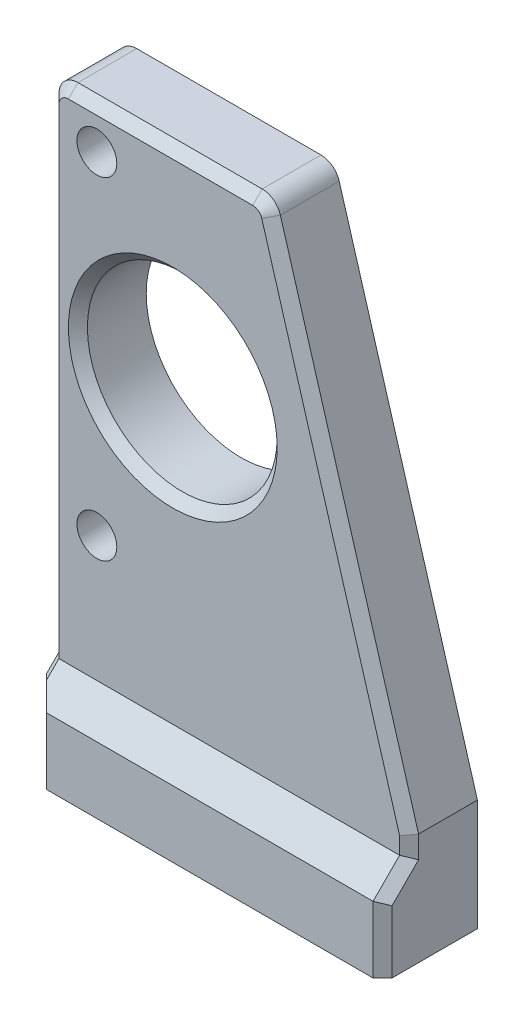
ISO-10303-21;
HEADER;
FILE_DESCRIPTION(('STEP AP214'),'2;1');
FILE_NAME('part.step','',(''),(''),'','','');
FILE_SCHEMA(('AUTOMOTIVE_DESIGN { 1 0 10303 214 1 1 1 1 }'));
ENDSEC;
DATA;
#1=APPLICATION_CONTEXT('core data for automotive mechanical design processes');
#2=APPLICATION_PROTOCOL_DEFINITION('international standard','automotive_design',2000,#1);
#3=PRODUCT_CONTEXT('',#1,'mechanical');
#4=PRODUCT('Part','Part','',(#3));
#5=PRODUCT_RELATED_PRODUCT_CATEGORY('part','',(#4));
#6=PRODUCT_DEFINITION_FORMATION('','',#4);
#7=PRODUCT_DEFINITION_CONTEXT('part definition',#1,'design');
#8=PRODUCT_DEFINITION('design','',#6,#7);
#9=PRODUCT_DEFINITION_SHAPE('','',#8);
#10=(LENGTH_UNIT() NAMED_UNIT(*) SI_UNIT(.MILLI.,.METRE.));
#11=(NAMED_UNIT(*) PLANE_ANGLE_UNIT() SI_UNIT($,.RADIAN.));
#12=(NAMED_UNIT(*) SI_UNIT($,.STERADIAN.) SOLID_ANGLE_UNIT());
#13=UNCERTAINTY_MEASURE_WITH_UNIT(LENGTH_MEASURE(1.E-05),#10,'distance_accuracy_value','');
#14=(GEOMETRIC_REPRESENTATION_CONTEXT(3) GLOBAL_UNCERTAINTY_ASSIGNED_CONTEXT((#13)) GLOBAL_UNIT_ASSIGNED_CONTEXT((#10,
#11,#12)) REPRESENTATION_CONTEXT('',''));
#15=CARTESIAN_POINT('',(0.,0.,0.));
#16=DIRECTION('',(0.,0.,1.));
#17=DIRECTION('',(1.,0.,0.));
#18=AXIS2_PLACEMENT_3D('',#15,#16,#17);
#19=CARTESIAN_POINT('',(-8.08878115586111,23.0319457170168,10.));
#20=DIRECTION('',(0.,0.,-1.));
#21=DIRECTION('',(-1.,0.,0.));
#22=AXIS2_PLACEMENT_3D('',#19,#20,#21);
#23=CYLINDRICAL_SURFACE('',#22,2.1);
#24=CARTESIAN_POINT('',(-8.08878115586111,23.0319457170168,7.2));
#25=DIRECTION('',(0.,0.,1.));
#26=DIRECTION('',(1.,0.,0.));
#27=AXIS2_PLACEMENT_3D('',#24,#25,#26);
#28=CIRCLE('',#27,2.1);
#29=CARTESIAN_POINT('',(-5.98878115586111,23.0319457170168,7.2));
#30=VERTEX_POINT('',#29);
#31=EDGE_CURVE('E183',#30,#30,#28,.T.);
#32=ORIENTED_EDGE('',*,*,#31,.T.);
#33=EDGE_LOOP('',(#32));
#34=FACE_BOUND('',#33,.T.);
#35=CARTESIAN_POINT('',(-8.08878115586111,23.0319457170168,3.));
#36=DIRECTION('',(0.,0.,-1.));
#37=DIRECTION('',(-1.,0.,0.));
#38=AXIS2_PLACEMENT_3D('',#35,#36,#37);
#39=CIRCLE('',#38,2.1);
#40=CARTESIAN_POINT('',(-10.1887811558611,23.0319457170168,3.));
#41=VERTEX_POINT('',#40);
#42=EDGE_CURVE('E41',#41,#41,#39,.T.);
#43=ORIENTED_EDGE('',*,*,#42,.T.);
#44=EDGE_LOOP('',(#43));
#45=FACE_BOUND('',#44,.T.);
#46=ADVANCED_FACE('F37',(#34,#45),#23,.F.);
#47=CARTESIAN_POINT('',(-13.0887811558611,62.3706180274269,10.));
#48=DIRECTION('',(0.,-1.,0.));
#49=DIRECTION('',(0.,0.,-1.));
#50=AXIS2_PLACEMENT_3D('',#47,#48,#49);
#51=PLANE('',#50);
#52=DIRECTION('',(0.,0.,-1.));
#53=VECTOR('',#52,1.);
#54=CARTESIAN_POINT('',(-11.0887811558611,62.3706180274269,10.));
#55=LINE('',#54,#53);
#56=CARTESIAN_POINT('',(-11.0887811558611,62.3706180274269,0.));
#57=VERTEX_POINT('',#56);
#58=CARTESIAN_POINT('',(-11.0887811558611,62.3706180274269,6.2));
#59=VERTEX_POINT('',#58);
#60=EDGE_CURVE('E201',#57,#59,#55,.F.);
#61=ORIENTED_EDGE('',*,*,#60,.T.);
#62=DIRECTION('',(1.,0.,0.));
#63=VECTOR('',#62,1.);
#64=CARTESIAN_POINT('',(8.33058138017552,62.3706180274269,6.2));
#65=LINE('',#64,#63);
#66=CARTESIAN_POINT('',(8.33058138017552,62.3706180274269,6.2));
#67=VERTEX_POINT('',#66);
#68=EDGE_CURVE('E249',#59,#67,#65,.T.);
#69=ORIENTED_EDGE('',*,*,#68,.T.);
#70=DIRECTION('',(0.,0.,-1.));
#71=VECTOR('',#70,1.);
#72=CARTESIAN_POINT('',(8.33058138017552,62.3706180274269,10.));
#73=LINE('',#72,#71);
#74=CARTESIAN_POINT('',(8.33058138017552,62.3706180274269,0.));
#75=VERTEX_POINT('',#74);
#76=EDGE_CURVE('E199',#67,#75,#73,.T.);
#77=ORIENTED_EDGE('',*,*,#76,.T.);
#78=DIRECTION('',(-1.,0.,0.));
#79=VECTOR('',#78,1.);
#80=CARTESIAN_POINT('',(-13.0887811558611,62.3706180274269,0.));
#81=LINE('',#80,#79);
#82=EDGE_CURVE('E177',#75,#57,#81,.T.);
#83=ORIENTED_EDGE('',*,*,#82,.T.);
#84=EDGE_LOOP('',(#61,#69,#77,#83));
#85=FACE_BOUND('',#84,.T.);
#86=ADVANCED_FACE('F340',(#85),#51,.F.);
#87=CARTESIAN_POINT('',(-8.08878115586112,58.0319457170168,10.));
#88=DIRECTION('',(0.,0.,-1.));
#89=DIRECTION('',(-1.,0.,0.));
#90=AXIS2_PLACEMENT_3D('',#87,#88,#89);
#91=CYLINDRICAL_SURFACE('',#90,2.1);
#92=CARTESIAN_POINT('',(-8.08878115586112,58.0319457170168,0.));
#93=DIRECTION('',(0.,0.,1.));
#94=DIRECTION('',(-1.,0.,0.));
#95=AXIS2_PLACEMENT_3D('',#92,#93,#94);
#96=CIRCLE('',#95,2.1);
#97=CARTESIAN_POINT('',(-10.1887811558611,58.0319457170168,0.));
#98=VERTEX_POINT('',#97);
#99=EDGE_CURVE('E343',#98,#98,#96,.T.);
#100=ORIENTED_EDGE('',*,*,#99,.F.);
#101=EDGE_LOOP('',(#100));
#102=FACE_BOUND('',#101,.T.);
#103=CARTESIAN_POINT('',(-8.08878115586112,58.0319457170168,7.2));
#104=DIRECTION('',(0.,0.,1.));
#105=DIRECTION('',(1.,0.,0.));
#106=AXIS2_PLACEMENT_3D('',#103,#104,#105);
#107=CIRCLE('',#106,2.1);
#108=CARTESIAN_POINT('',(-5.98878115586112,58.0319457170168,7.2));
#109=VERTEX_POINT('',#108);
#110=EDGE_CURVE('E186',#109,#109,#107,.T.);
#111=ORIENTED_EDGE('',*,*,#110,.T.);
#112=EDGE_LOOP('',(#111));
#113=FACE_BOUND('',#112,.T.);
#114=ADVANCED_FACE('F399',(#102,#113),#91,.F.);
#115=CARTESIAN_POINT('',(0.,0.,10.));
#116=DIRECTION('',(0.,0.,-1.));
#117=DIRECTION('',(-1.,0.,0.));
#118=AXIS2_PLACEMENT_3D('',#115,#116,#117);
#119=PLANE('',#118);
#120=DIRECTION('',(-1.,0.,0.));
#121=VECTOR('',#120,1.);
#122=CARTESIAN_POINT('',(0.,6.99999999999997,10.));
#123=LINE('',#122,#121);
#124=CARTESIAN_POINT('',(23.8127338897394,6.99999999999997,10.));
#125=VERTEX_POINT('',#124);
#126=CARTESIAN_POINT('',(-10.5887811558611,6.99999999999997,10.));
#127=VERTEX_POINT('',#126);
#128=EDGE_CURVE('E182',#125,#127,#123,.T.);
#129=ORIENTED_EDGE('',*,*,#128,.T.);
#130=DIRECTION('',(0.,-1.,0.));
#131=VECTOR('',#130,1.);
#132=CARTESIAN_POINT('',(-10.5887811558611,0.,10.));
#133=LINE('',#132,#131);
#134=CARTESIAN_POINT('',(-10.5887811558611,0.,10.));
#135=VERTEX_POINT('',#134);
#136=EDGE_CURVE('E251',#127,#135,#133,.T.);
#137=ORIENTED_EDGE('',*,*,#136,.T.);
#138=DIRECTION('',(1.,0.,0.));
#139=VECTOR('',#138,1.);
#140=CARTESIAN_POINT('',(28.2870012815656,0.,10.));
#141=LINE('',#140,#139);
#142=CARTESIAN_POINT('',(23.8127338897394,0.,10.));
#143=VERTEX_POINT('',#142);
#144=EDGE_CURVE('E173',#135,#143,#141,.T.);
#145=ORIENTED_EDGE('',*,*,#144,.T.);
#146=DIRECTION('',(0.,1.,0.));
#147=VECTOR('',#146,1.);
#148=CARTESIAN_POINT('',(23.8127338897394,0.,10.));
#149=LINE('',#148,#147);
#150=EDGE_CURVE('E225',#143,#125,#149,.T.);
#151=ORIENTED_EDGE('',*,*,#150,.T.);
#152=EDGE_LOOP('',(#129,#137,#145,#151));
#153=FACE_BOUND('',#152,.T.);
#154=ADVANCED_FACE('F288',(#153),#119,.F.);
#155=CARTESIAN_POINT('',(0.,0.,0.));
#156=DIRECTION('',(0.,0.,-1.));
#157=DIRECTION('',(-1.,0.,0.));
#158=AXIS2_PLACEMENT_3D('',#155,#156,#157);
#159=PLANE('',#158);
#160=CARTESIAN_POINT('',(-8.08878115586111,23.0319457170168,0.));
#161=DIRECTION('',(0.,0.,-1.));
#162=DIRECTION('',(-1.,0.,0.));
#163=AXIS2_PLACEMENT_3D('',#160,#161,#162);
#164=CIRCLE('',#163,3.6);
#165=CARTESIAN_POINT('',(-11.6887811558611,23.0319457170168,0.));
#166=VERTEX_POINT('',#165);
#167=EDGE_CURVE('E371',#166,#166,#164,.T.);
#168=ORIENTED_EDGE('',*,*,#167,.F.);
#169=EDGE_LOOP('',(#168));
#170=FACE_BOUND('',#169,.T.);
#171=DIRECTION('',(0.,-1.,0.));
#172=VECTOR('',#171,1.);
#173=CARTESIAN_POINT('',(-13.0887811558611,0.,0.));
#174=LINE('',#173,#172);
#175=CARTESIAN_POINT('',(-13.0887811558611,60.3706180274269,0.));
#176=VERTEX_POINT('',#175);
#177=CARTESIAN_POINT('',(-13.0887811558611,0.,0.));
#178=VERTEX_POINT('',#177);
#179=EDGE_CURVE('E174',#176,#178,#174,.T.);
#180=ORIENTED_EDGE('',*,*,#179,.F.);
#181=CARTESIAN_POINT('',(-11.0887811558611,60.3706180274269,0.));
#182=DIRECTION('',(0.,0.,-1.));
#183=DIRECTION('',(-1.,0.,0.));
#184=AXIS2_PLACEMENT_3D('',#181,#182,#183);
#185=CIRCLE('',#184,2.);
#186=EDGE_CURVE('E197',#176,#57,#185,.T.);
#187=ORIENTED_EDGE('',*,*,#186,.T.);
#188=ORIENTED_EDGE('',*,*,#82,.F.);
#189=CARTESIAN_POINT('',(8.33058138017552,60.3706180274269,0.));
#190=DIRECTION('',(0.,0.,-1.));
#191=DIRECTION('',(-1.,0.,0.));
#192=AXIS2_PLACEMENT_3D('',#189,#190,#191);
#193=CIRCLE('',#192,2.);
#194=CARTESIAN_POINT('',(10.2483242545276,60.9382995119514,0.));
#195=VERTEX_POINT('',#194);
#196=EDGE_CURVE('E195',#75,#195,#193,.T.);
#197=ORIENTED_EDGE('',*,*,#196,.T.);
#198=DIRECTION('',(-0.283840742262227,0.958871437176032,0.));
#199=VECTOR('',#198,1.);
#200=CARTESIAN_POINT('',(24.8127338897394,11.7367779571846,0.));
#201=LINE('',#200,#199);
#202=CARTESIAN_POINT('',(24.8127338897394,11.7367779571846,0.));
#203=VERTEX_POINT('',#202);
#204=EDGE_CURVE('E158',#203,#195,#201,.T.);
#205=ORIENTED_EDGE('',*,*,#204,.F.);
#206=DIRECTION('',(0.,1.,0.));
#207=VECTOR('',#206,1.);
#208=CARTESIAN_POINT('',(24.8127338897394,11.7367779571846,0.));
#209=LINE('',#208,#207);
#210=CARTESIAN_POINT('',(24.8127338897394,0.,0.));
#211=VERTEX_POINT('',#210);
#212=EDGE_CURVE('E149',#211,#203,#209,.T.);
#213=ORIENTED_EDGE('',*,*,#212,.F.);
#214=DIRECTION('',(1.,0.,0.));
#215=VECTOR('',#214,1.);
#216=CARTESIAN_POINT('',(28.2870012815656,0.,0.));
#217=LINE('',#216,#215);
#218=EDGE_CURVE('E165',#178,#211,#217,.T.);
#219=ORIENTED_EDGE('',*,*,#218,.F.);
#220=EDGE_LOOP('',(#180,#187,#188,#197,#205,#213,#219));
#221=FACE_BOUND('',#220,.T.);
#222=CARTESIAN_POINT('',(-0.0887811558611135,40.5319457170168,0.));
#223=DIRECTION('',(0.,0.,1.));
#224=DIRECTION('',(1.,0.,0.));
#225=AXIS2_PLACEMENT_3D('',#222,#223,#224);
#226=CIRCLE('',#225,10.);
#227=CARTESIAN_POINT('',(9.91121884413889,40.5319457170168,0.));
#228=VERTEX_POINT('',#227);
#229=EDGE_CURVE('E187',#228,#228,#226,.T.);
#230=ORIENTED_EDGE('',*,*,#229,.T.);
#231=EDGE_LOOP('',(#230));
#232=FACE_BOUND('',#231,.T.);
#233=ORIENTED_EDGE('',*,*,#99,.T.);
#234=EDGE_LOOP('',(#233));
#235=FACE_BOUND('',#234,.T.);
#236=ADVANCED_FACE('F163',(#170,#221,#232,#235),#159,.T.);
#237=CARTESIAN_POINT('',(-13.0887811558611,0.,10.));
#238=DIRECTION('',(1.,0.,0.));
#239=DIRECTION('',(0.,0.,-1.));
#240=AXIS2_PLACEMENT_3D('',#237,#238,#239);
#241=PLANE('',#240);
#242=DIRECTION('',(0.,0.,-1.));
#243=VECTOR('',#242,1.);
#244=CARTESIAN_POINT('',(-13.0887811558611,0.,10.));
#245=LINE('',#244,#243);
#246=CARTESIAN_POINT('',(-13.0887811558611,0.,7.49999999999999));
#247=VERTEX_POINT('',#246);
#248=EDGE_CURVE('E171',#247,#178,#245,.T.);
#249=ORIENTED_EDGE('',*,*,#248,.F.);
#250=DIRECTION('',(0.,1.,0.));
#251=VECTOR('',#250,1.);
#252=CARTESIAN_POINT('',(-13.0887811558611,0.,7.49999999999999));
#253=LINE('',#252,#251);
#254=CARTESIAN_POINT('',(-13.0887811558611,8.08578643762687,7.49999999999999));
#255=VERTEX_POINT('',#254);
#256=EDGE_CURVE('E60',#247,#255,#253,.T.);
#257=ORIENTED_EDGE('',*,*,#256,.T.);
#258=DIRECTION('',(0.,0.707106781186544,-0.707106781186551));
#259=VECTOR('',#258,1.);
#260=CARTESIAN_POINT('',(-13.0887811558611,9.0928932188134,6.49289321881346));
#261=LINE('',#260,#259);
#262=CARTESIAN_POINT('',(-13.0887811558611,9.38578643762685,6.2));
#263=VERTEX_POINT('',#262);
#264=EDGE_CURVE('E241',#255,#263,#261,.T.);
#265=ORIENTED_EDGE('',*,*,#264,.T.);
#266=DIRECTION('',(0.,1.,0.));
#267=VECTOR('',#266,1.);
#268=CARTESIAN_POINT('',(-13.0887811558611,60.3706180274269,6.2));
#269=LINE('',#268,#267);
#270=CARTESIAN_POINT('',(-13.0887811558611,60.3706180274269,6.2));
#271=VERTEX_POINT('',#270);
#272=EDGE_CURVE('E239',#263,#271,#269,.T.);
#273=ORIENTED_EDGE('',*,*,#272,.T.);
#274=DIRECTION('',(0.,0.,-1.));
#275=VECTOR('',#274,1.);
#276=CARTESIAN_POINT('',(-13.0887811558611,60.3706180274269,10.));
#277=LINE('',#276,#275);
#278=EDGE_CURVE('E193',#271,#176,#277,.T.);
#279=ORIENTED_EDGE('',*,*,#278,.T.);
#280=ORIENTED_EDGE('',*,*,#179,.T.);
#281=EDGE_LOOP('',(#249,#257,#265,#273,#279,#280));
#282=FACE_BOUND('',#281,.T.);
#283=ADVANCED_FACE('F281',(#282),#241,.F.);
#284=CARTESIAN_POINT('',(28.2870012815656,0.,10.));
#285=DIRECTION('',(0.,1.,0.));
#286=DIRECTION('',(-1.,0.,0.));
#287=AXIS2_PLACEMENT_3D('',#284,#285,#286);
#288=PLANE('',#287);
#289=CARTESIAN_POINT('',(6.18,0.,5.));
#290=DIRECTION('',(0.,-1.,0.));
#291=DIRECTION('',(1.,0.,0.));
#292=AXIS2_PLACEMENT_3D('',#289,#290,#291);
#293=CIRCLE('',#292,1.5);
#294=CARTESIAN_POINT('',(7.68,0.,5.));
#295=VERTEX_POINT('',#294);
#296=EDGE_CURVE('E360',#295,#295,#293,.T.);
#297=ORIENTED_EDGE('',*,*,#296,.F.);
#298=EDGE_LOOP('',(#297));
#299=FACE_BOUND('',#298,.T.);
#300=CARTESIAN_POINT('',(19.36,0.,5.));
#301=DIRECTION('',(0.,-1.,0.));
#302=DIRECTION('',(1.,0.,0.));
#303=AXIS2_PLACEMENT_3D('',#300,#301,#302);
#304=CIRCLE('',#303,1.5);
#305=CARTESIAN_POINT('',(20.86,0.,5.));
#306=VERTEX_POINT('',#305);
#307=EDGE_CURVE('E354',#306,#306,#304,.T.);
#308=ORIENTED_EDGE('',*,*,#307,.F.);
#309=EDGE_LOOP('',(#308));
#310=FACE_BOUND('',#309,.T.);
#311=CARTESIAN_POINT('',(-7.,0.,5.));
#312=DIRECTION('',(0.,-1.,0.));
#313=DIRECTION('',(1.,0.,0.));
#314=AXIS2_PLACEMENT_3D('',#311,#312,#313);
#315=CIRCLE('',#314,1.5);
#316=CARTESIAN_POINT('',(-5.5,0.,5.));
#317=VERTEX_POINT('',#316);
#318=EDGE_CURVE('E348',#317,#317,#315,.T.);
#319=ORIENTED_EDGE('',*,*,#318,.F.);
#320=EDGE_LOOP('',(#319));
#321=FACE_BOUND('',#320,.T.);
#322=ORIENTED_EDGE('',*,*,#144,.F.);
#323=DIRECTION('',(0.707106781186547,0.,0.707106781186549));
#324=VECTOR('',#323,1.);
#325=CARTESIAN_POINT('',(-10.5887811558611,0.,10.));
#326=LINE('',#325,#324);
#327=EDGE_CURVE('E276',#135,#247,#326,.F.);
#328=ORIENTED_EDGE('',*,*,#327,.T.);
#329=ORIENTED_EDGE('',*,*,#248,.T.);
#330=ORIENTED_EDGE('',*,*,#218,.T.);
#331=DIRECTION('',(0.,0.,-1.));
#332=VECTOR('',#331,1.);
#333=CARTESIAN_POINT('',(24.8127338897394,0.,10.));
#334=LINE('',#333,#332);
#335=CARTESIAN_POINT('',(24.8127338897394,0.,9.00000000000001));
#336=VERTEX_POINT('',#335);
#337=EDGE_CURVE('E145',#336,#211,#334,.T.);
#338=ORIENTED_EDGE('',*,*,#337,.F.);
#339=DIRECTION('',(0.70710678118655,0.,-0.707106781186545));
#340=VECTOR('',#339,1.);
#341=CARTESIAN_POINT('',(23.8127338897394,0.,10.));
#342=LINE('',#341,#340);
#343=EDGE_CURVE('E233',#336,#143,#342,.F.);
#344=ORIENTED_EDGE('',*,*,#343,.T.);
#345=EDGE_LOOP('',(#322,#328,#329,#330,#338,#344));
#346=FACE_BOUND('',#345,.T.);
#347=ADVANCED_FACE('F170',(#299,#310,#321,#346),#288,.F.);
#348=CARTESIAN_POINT('',(-7.,8.,5.));
#349=DIRECTION('',(0.,-1.,0.));
#350=DIRECTION('',(1.,0.,0.));
#351=AXIS2_PLACEMENT_3D('',#348,#349,#350);
#352=CYLINDRICAL_SURFACE('',#351,1.5);
#353=CARTESIAN_POINT('',(-7.,8.,5.));
#354=DIRECTION('',(0.,-1.,0.));
#355=DIRECTION('',(1.,0.,0.));
#356=AXIS2_PLACEMENT_3D('',#353,#354,#355);
#357=CIRCLE('',#356,1.5);
#358=CARTESIAN_POINT('',(-5.5,8.,5.));
#359=VERTEX_POINT('',#358);
#360=EDGE_CURVE('E345',#359,#359,#357,.T.);
#361=ORIENTED_EDGE('',*,*,#360,.F.);
#362=EDGE_LOOP('',(#361));
#363=FACE_BOUND('',#362,.T.);
#364=ORIENTED_EDGE('',*,*,#318,.T.);
#365=EDGE_LOOP('',(#364));
#366=FACE_BOUND('',#365,.T.);
#367=ADVANCED_FACE('F403',(#363,#366),#352,.F.);
#368=CARTESIAN_POINT('',(-7.,8.,5.));
#369=DIRECTION('',(0.,-1.,0.));
#370=DIRECTION('',(1.,0.,0.));
#371=AXIS2_PLACEMENT_3D('',#368,#369,#370);
#372=PLANE('',#371);
#373=ORIENTED_EDGE('',*,*,#360,.T.);
#374=EDGE_LOOP('',(#373));
#375=FACE_BOUND('',#374,.T.);
#376=ADVANCED_FACE('F526',(#375),#372,.T.);
#377=CARTESIAN_POINT('',(19.36,8.,5.));
#378=DIRECTION('',(0.,-1.,0.));
#379=DIRECTION('',(1.,0.,0.));
#380=AXIS2_PLACEMENT_3D('',#377,#378,#379);
#381=CYLINDRICAL_SURFACE('',#380,1.5);
#382=CARTESIAN_POINT('',(19.36,8.,5.));
#383=DIRECTION('',(0.,-1.,0.));
#384=DIRECTION('',(1.,0.,0.));
#385=AXIS2_PLACEMENT_3D('',#382,#383,#384);
#386=CIRCLE('',#385,1.5);
#387=CARTESIAN_POINT('',(20.86,8.,5.));
#388=VERTEX_POINT('',#387);
#389=EDGE_CURVE('E357',#388,#388,#386,.T.);
#390=ORIENTED_EDGE('',*,*,#389,.F.);
#391=EDGE_LOOP('',(#390));
#392=FACE_BOUND('',#391,.T.);
#393=ORIENTED_EDGE('',*,*,#307,.T.);
#394=EDGE_LOOP('',(#393));
#395=FACE_BOUND('',#394,.T.);
#396=ADVANCED_FACE('F533',(#392,#395),#381,.F.);
#397=CARTESIAN_POINT('',(19.36,8.,5.));
#398=DIRECTION('',(0.,-1.,0.));
#399=DIRECTION('',(1.,0.,0.));
#400=AXIS2_PLACEMENT_3D('',#397,#398,#399);
#401=PLANE('',#400);
#402=ORIENTED_EDGE('',*,*,#389,.T.);
#403=EDGE_LOOP('',(#402));
#404=FACE_BOUND('',#403,.T.);
#405=ADVANCED_FACE('F540',(#404),#401,.T.);
#406=CARTESIAN_POINT('',(6.18,8.,5.));
#407=DIRECTION('',(0.,-1.,0.));
#408=DIRECTION('',(1.,0.,0.));
#409=AXIS2_PLACEMENT_3D('',#406,#407,#408);
#410=CYLINDRICAL_SURFACE('',#409,1.5);
#411=CARTESIAN_POINT('',(6.18,8.,5.));
#412=DIRECTION('',(0.,-1.,0.));
#413=DIRECTION('',(1.,0.,0.));
#414=AXIS2_PLACEMENT_3D('',#411,#412,#413);
#415=CIRCLE('',#414,1.5);
#416=CARTESIAN_POINT('',(7.68,8.,5.));
#417=VERTEX_POINT('',#416);
#418=EDGE_CURVE('E351',#417,#417,#415,.T.);
#419=ORIENTED_EDGE('',*,*,#418,.F.);
#420=EDGE_LOOP('',(#419));
#421=FACE_BOUND('',#420,.T.);
#422=ORIENTED_EDGE('',*,*,#296,.T.);
#423=EDGE_LOOP('',(#422));
#424=FACE_BOUND('',#423,.T.);
#425=ADVANCED_FACE('F548',(#421,#424),#410,.F.);
#426=CARTESIAN_POINT('',(6.18,8.,5.));
#427=DIRECTION('',(0.,-1.,0.));
#428=DIRECTION('',(1.,0.,0.));
#429=AXIS2_PLACEMENT_3D('',#426,#427,#428);
#430=PLANE('',#429);
#431=ORIENTED_EDGE('',*,*,#418,.T.);
#432=EDGE_LOOP('',(#431));
#433=FACE_BOUND('',#432,.T.);
#434=ADVANCED_FACE('F556',(#433),#430,.T.);
#435=CARTESIAN_POINT('',(0.,0.,7.2));
#436=DIRECTION('',(0.,0.,1.));
#437=DIRECTION('',(1.,0.,0.));
#438=AXIS2_PLACEMENT_3D('',#435,#436,#437);
#439=PLANE('',#438);
#440=CARTESIAN_POINT('',(-0.0887811558611135,40.5319457170168,7.2));
#441=DIRECTION('',(0.,0.,1.));
#442=DIRECTION('',(1.,0.,0.));
#443=AXIS2_PLACEMENT_3D('',#440,#441,#442);
#444=CIRCLE('',#443,11.);
#445=CARTESIAN_POINT('',(10.9112188441389,40.5319457170168,7.2));
#446=VERTEX_POINT('',#445);
#447=EDGE_CURVE('E222',#446,#446,#444,.F.);
#448=ORIENTED_EDGE('',*,*,#447,.T.);
#449=EDGE_LOOP('',(#448));
#450=FACE_BOUND('',#449,.T.);
#451=DIRECTION('',(-1.,0.,0.));
#452=VECTOR('',#451,1.);
#453=CARTESIAN_POINT('',(-15.0951683588392,9.79999999999994,7.2));
#454=LINE('',#453,#452);
#455=CARTESIAN_POINT('',(-12.0887811558611,9.79999999999994,7.2));
#456=VERTEX_POINT('',#455);
#457=CARTESIAN_POINT('',(23.8127338897394,9.79999999999994,7.2));
#458=VERTEX_POINT('',#457);
#459=EDGE_CURVE('E190',#456,#458,#454,.F.);
#460=ORIENTED_EDGE('',*,*,#459,.T.);
#461=DIRECTION('',(0.,1.,0.));
#462=VECTOR('',#461,1.);
#463=CARTESIAN_POINT('',(23.8127338897394,11.7367779571846,7.2));
#464=LINE('',#463,#462);
#465=CARTESIAN_POINT('',(23.8127338897394,11.5918778188318,7.2));
#466=VERTEX_POINT('',#465);
#467=EDGE_CURVE('E220',#458,#466,#464,.T.);
#468=ORIENTED_EDGE('',*,*,#467,.T.);
#469=DIRECTION('',(-0.283840742262227,0.958871437176032,0.));
#470=VECTOR('',#469,1.);
#471=CARTESIAN_POINT('',(9.28945281735155,60.6544587696892,7.2));
#472=LINE('',#471,#470);
#473=CARTESIAN_POINT('',(9.28945281735156,60.6544587696892,7.2));
#474=VERTEX_POINT('',#473);
#475=EDGE_CURVE('E218',#466,#474,#472,.T.);
#476=ORIENTED_EDGE('',*,*,#475,.T.);
#477=CARTESIAN_POINT('',(8.33058138017552,60.3706180274269,7.2));
#478=DIRECTION('',(0.,0.,1.));
#479=DIRECTION('',(1.,0.,0.));
#480=AXIS2_PLACEMENT_3D('',#477,#478,#479);
#481=CIRCLE('',#480,1.00000000000001);
#482=CARTESIAN_POINT('',(8.33058138017552,61.3706180274269,7.2));
#483=VERTEX_POINT('',#482);
#484=EDGE_CURVE('E214',#474,#483,#481,.T.);
#485=ORIENTED_EDGE('',*,*,#484,.T.);
#486=DIRECTION('',(-1.,0.,0.));
#487=VECTOR('',#486,1.);
#488=CARTESIAN_POINT('',(-11.0887811558611,61.3706180274269,7.2));
#489=LINE('',#488,#487);
#490=CARTESIAN_POINT('',(-11.0887811558611,61.3706180274269,7.2));
#491=VERTEX_POINT('',#490);
#492=EDGE_CURVE('E210',#483,#491,#489,.T.);
#493=ORIENTED_EDGE('',*,*,#492,.T.);
#494=CARTESIAN_POINT('',(-11.0887811558611,60.3706180274269,7.2));
#495=DIRECTION('',(0.,0.,1.));
#496=DIRECTION('',(1.,0.,0.));
#497=AXIS2_PLACEMENT_3D('',#494,#495,#496);
#498=CIRCLE('',#497,1.00000000000001);
#499=CARTESIAN_POINT('',(-12.0887811558611,60.3706180274269,7.2));
#500=VERTEX_POINT('',#499);
#501=EDGE_CURVE('E212',#491,#500,#498,.T.);
#502=ORIENTED_EDGE('',*,*,#501,.T.);
#503=DIRECTION('',(0.,-1.,0.));
#504=VECTOR('',#503,1.);
#505=CARTESIAN_POINT('',(-12.0887811558611,9.79999999999994,7.2));
#506=LINE('',#505,#504);
#507=EDGE_CURVE('E216',#500,#456,#506,.T.);
#508=ORIENTED_EDGE('',*,*,#507,.T.);
#509=EDGE_LOOP('',(#460,#468,#476,#485,#493,#502,#508));
#510=FACE_BOUND('',#509,.T.);
#511=ORIENTED_EDGE('',*,*,#31,.F.);
#512=EDGE_LOOP('',(#511));
#513=FACE_BOUND('',#512,.T.);
#514=ORIENTED_EDGE('',*,*,#110,.F.);
#515=EDGE_LOOP('',(#514));
#516=FACE_BOUND('',#515,.T.);
#517=ADVANCED_FACE('F300',(#450,#510,#513,#516),#439,.T.);
#518=CARTESIAN_POINT('',(-0.0887811558611135,40.5319457170168,0.));
#519=DIRECTION('',(0.,0.,1.));
#520=DIRECTION('',(1.,0.,0.));
#521=AXIS2_PLACEMENT_3D('',#518,#519,#520);
#522=CYLINDRICAL_SURFACE('',#521,10.);
#523=CARTESIAN_POINT('',(-0.0887811558611135,40.5319457170168,6.2));
#524=DIRECTION('',(0.,0.,1.));
#525=DIRECTION('',(1.,0.,0.));
#526=AXIS2_PLACEMENT_3D('',#523,#524,#525);
#527=CIRCLE('',#526,10.);
#528=CARTESIAN_POINT('',(9.91121884413889,40.5319457170168,6.2));
#529=VERTEX_POINT('',#528);
#530=EDGE_CURVE('E207',#529,#529,#527,.T.);
#531=ORIENTED_EDGE('',*,*,#530,.T.);
#532=EDGE_LOOP('',(#531));
#533=FACE_BOUND('',#532,.T.);
#534=ORIENTED_EDGE('',*,*,#229,.F.);
#535=EDGE_LOOP('',(#534));
#536=FACE_BOUND('',#535,.T.);
#537=ADVANCED_FACE('F420',(#533,#536),#522,.F.);
#538=CARTESIAN_POINT('',(-15.0951683588392,9.99999999999999,6.99999999999995));
#539=DIRECTION('',(0.,-0.707106781186551,-0.707106781186544));
#540=DIRECTION('',(1.,0.,0.));
#541=AXIS2_PLACEMENT_3D('',#538,#539,#540);
#542=PLANE('',#541);
#543=DIRECTION('',(0.,0.707106781186544,-0.707106781186551));
#544=VECTOR('',#543,1.);
#545=CARTESIAN_POINT('',(-12.0887811558611,6.99999999999997,10.));
#546=LINE('',#545,#544);
#547=CARTESIAN_POINT('',(-12.0887811558611,8.49999999999996,8.49999999999999));
#548=VERTEX_POINT('',#547);
#549=EDGE_CURVE('E235',#456,#548,#546,.F.);
#550=ORIENTED_EDGE('',*,*,#549,.T.);
#551=DIRECTION('',(0.577350269189627,-0.577350269189622,0.577350269189628));
#552=VECTOR('',#551,1.);
#553=CARTESIAN_POINT('',(-14.0909102235205,10.5021290676594,6.49787093234058));
#554=LINE('',#553,#552);
#555=EDGE_CURVE('E11',#548,#127,#554,.T.);
#556=ORIENTED_EDGE('',*,*,#555,.T.);
#557=ORIENTED_EDGE('',*,*,#128,.F.);
#558=DIRECTION('',(0.,-0.707106781186544,0.707106781186551));
#559=VECTOR('',#558,1.);
#560=CARTESIAN_POINT('',(23.8127338897394,9.79999999999994,7.2));
#561=LINE('',#560,#559);
#562=EDGE_CURVE('E237',#125,#458,#561,.F.);
#563=ORIENTED_EDGE('',*,*,#562,.T.);
#564=ORIENTED_EDGE('',*,*,#459,.F.);
#565=EDGE_LOOP('',(#550,#556,#557,#563,#564));
#566=FACE_BOUND('',#565,.T.);
#567=ADVANCED_FACE('F285',(#566),#542,.F.);
#568=CARTESIAN_POINT('',(24.8127338897394,11.7367779571846,10.));
#569=DIRECTION('',(-0.958871437176032,-0.283840742262227,0.));
#570=DIRECTION('',(0.283840742262227,-0.958871437176032,0.));
#571=AXIS2_PLACEMENT_3D('',#568,#569,#570);
#572=PLANE('',#571);
#573=DIRECTION('',(0.,0.,-1.));
#574=VECTOR('',#573,1.);
#575=CARTESIAN_POINT('',(10.2483242545276,60.9382995119514,10.));
#576=LINE('',#575,#574);
#577=CARTESIAN_POINT('',(10.2483242545276,60.9382995119514,6.2));
#578=VERTEX_POINT('',#577);
#579=EDGE_CURVE('E204',#195,#578,#576,.F.);
#580=ORIENTED_EDGE('',*,*,#579,.T.);
#581=DIRECTION('',(0.283840742262227,-0.958871437176032,0.));
#582=VECTOR('',#581,1.);
#583=CARTESIAN_POINT('',(24.8127338897394,11.7367779571846,6.2));
#584=LINE('',#583,#582);
#585=CARTESIAN_POINT('',(24.8127338897394,11.7367779571846,6.2));
#586=VERTEX_POINT('',#585);
#587=EDGE_CURVE('E243',#578,#586,#584,.T.);
#588=ORIENTED_EDGE('',*,*,#587,.T.);
#589=DIRECTION('',(0.,0.,-1.));
#590=VECTOR('',#589,1.);
#591=CARTESIAN_POINT('',(24.8127338897394,11.7367779571846,10.));
#592=LINE('',#591,#590);
#593=EDGE_CURVE('E157',#586,#203,#592,.T.);
#594=ORIENTED_EDGE('',*,*,#593,.T.);
#595=ORIENTED_EDGE('',*,*,#204,.T.);
#596=EDGE_LOOP('',(#580,#588,#594,#595));
#597=FACE_BOUND('',#596,.T.);
#598=ADVANCED_FACE('F419',(#597),#572,.F.);
#599=CARTESIAN_POINT('',(24.8127338897394,11.7367779571846,10.));
#600=DIRECTION('',(-1.,0.,0.));
#601=DIRECTION('',(0.,-1.,0.));
#602=AXIS2_PLACEMENT_3D('',#599,#600,#601);
#603=PLANE('',#602);
#604=DIRECTION('',(0.,-0.707106781186544,0.707106781186551));
#605=VECTOR('',#604,1.);
#606=CARTESIAN_POINT('',(24.8127338897394,6.29289321881343,9.29289321881346));
#607=LINE('',#606,#605);
#608=CARTESIAN_POINT('',(24.8127338897394,9.38578643762685,6.20000000000001));
#609=VERTEX_POINT('',#608);
#610=CARTESIAN_POINT('',(24.8127338897394,6.58578643762688,9.00000000000001));
#611=VERTEX_POINT('',#610);
#612=EDGE_CURVE('E230',#609,#611,#607,.T.);
#613=ORIENTED_EDGE('',*,*,#612,.T.);
#614=DIRECTION('',(0.,-1.,0.));
#615=VECTOR('',#614,1.);
#616=CARTESIAN_POINT('',(24.8127338897394,11.7367779571846,9.00000000000001));
#617=LINE('',#616,#615);
#618=EDGE_CURVE('E152',#611,#336,#617,.T.);
#619=ORIENTED_EDGE('',*,*,#618,.T.);
#620=ORIENTED_EDGE('',*,*,#337,.T.);
#621=ORIENTED_EDGE('',*,*,#212,.T.);
#622=ORIENTED_EDGE('',*,*,#593,.F.);
#623=DIRECTION('',(0.,-1.,0.));
#624=VECTOR('',#623,1.);
#625=CARTESIAN_POINT('',(24.8127338897394,9.79999999999994,6.20000000000001));
#626=LINE('',#625,#624);
#627=EDGE_CURVE('E228',#586,#609,#626,.T.);
#628=ORIENTED_EDGE('',*,*,#627,.T.);
#629=EDGE_LOOP('',(#613,#619,#620,#621,#622,#628));
#630=FACE_BOUND('',#629,.T.);
#631=ADVANCED_FACE('F147',(#630),#603,.F.);
#632=CARTESIAN_POINT('',(-11.0887811558611,60.3706180274269,10.));
#633=DIRECTION('',(0.,0.,-1.));
#634=DIRECTION('',(-1.,0.,0.));
#635=AXIS2_PLACEMENT_3D('',#632,#633,#634);
#636=CYLINDRICAL_SURFACE('',#635,2.);
#637=ORIENTED_EDGE('',*,*,#278,.F.);
#638=CARTESIAN_POINT('',(-11.0887811558611,60.3706180274269,6.2));
#639=DIRECTION('',(0.,0.,1.));
#640=DIRECTION('',(1.,0.,0.));
#641=AXIS2_PLACEMENT_3D('',#638,#639,#640);
#642=CIRCLE('',#641,2.);
#643=EDGE_CURVE('E247',#271,#59,#642,.F.);
#644=ORIENTED_EDGE('',*,*,#643,.T.);
#645=ORIENTED_EDGE('',*,*,#60,.F.);
#646=ORIENTED_EDGE('',*,*,#186,.F.);
#647=EDGE_LOOP('',(#637,#644,#645,#646));
#648=FACE_BOUND('',#647,.T.);
#649=ADVANCED_FACE('F335',(#648),#636,.T.);
#650=CARTESIAN_POINT('',(8.33058138017552,60.3706180274269,10.));
#651=DIRECTION('',(0.,0.,-1.));
#652=DIRECTION('',(-1.,0.,0.));
#653=AXIS2_PLACEMENT_3D('',#650,#651,#652);
#654=CYLINDRICAL_SURFACE('',#653,2.);
#655=ORIENTED_EDGE('',*,*,#76,.F.);
#656=CARTESIAN_POINT('',(8.33058138017552,60.3706180274269,6.2));
#657=DIRECTION('',(0.,0.,1.));
#658=DIRECTION('',(1.,0.,0.));
#659=AXIS2_PLACEMENT_3D('',#656,#657,#658);
#660=CIRCLE('',#659,2.);
#661=EDGE_CURVE('E245',#67,#578,#660,.F.);
#662=ORIENTED_EDGE('',*,*,#661,.T.);
#663=ORIENTED_EDGE('',*,*,#579,.F.);
#664=ORIENTED_EDGE('',*,*,#196,.F.);
#665=EDGE_LOOP('',(#655,#662,#663,#664));
#666=FACE_BOUND('',#665,.T.);
#667=ADVANCED_FACE('F423',(#666),#654,.T.);
#668=CARTESIAN_POINT('',(-0.0887811558611135,40.5319457170168,6.2));
#669=DIRECTION('',(0.,0.,1.));
#670=DIRECTION('',(1.,0.,0.));
#671=AXIS2_PLACEMENT_3D('',#668,#669,#670);
#672=CONICAL_SURFACE('',#671,10.,0.785398163397452);
#673=ORIENTED_EDGE('',*,*,#447,.F.);
#674=EDGE_LOOP('',(#673));
#675=FACE_BOUND('',#674,.T.);
#676=ORIENTED_EDGE('',*,*,#530,.F.);
#677=EDGE_LOOP('',(#676));
#678=FACE_BOUND('',#677,.T.);
#679=ADVANCED_FACE('F426',(#675,#678),#672,.F.);
#680=CARTESIAN_POINT('',(-13.0887811558611,2.79289321881347,12.7928932188134));
#681=DIRECTION('',(0.707106781186546,-0.500000000000004,-0.499999999999999));
#682=DIRECTION('',(0.,0.707106781186544,-0.707106781186551));
#683=AXIS2_PLACEMENT_3D('',#680,#681,#682);
#684=PLANE('',#683);
#685=ORIENTED_EDGE('',*,*,#264,.F.);
#686=DIRECTION('',(0.678598344545847,0.281084637714816,0.678598344545849));
#687=VECTOR('',#686,1.);
#688=CARTESIAN_POINT('',(-11.6610118653527,8.67718784169525,8.92776929050839));
#689=LINE('',#688,#687);
#690=EDGE_CURVE('E46',#255,#548,#689,.T.);
#691=ORIENTED_EDGE('',*,*,#690,.T.);
#692=ORIENTED_EDGE('',*,*,#549,.F.);
#693=DIRECTION('',(-0.678598344545846,-0.281084637714813,-0.678598344545851));
#694=VECTOR('',#693,1.);
#695=CARTESIAN_POINT('',(-11.3103340789459,10.1224433368479,7.9784470769152));
#696=LINE('',#695,#694);
#697=EDGE_CURVE('E167',#263,#456,#696,.F.);
#698=ORIENTED_EDGE('',*,*,#697,.F.);
#699=EDGE_LOOP('',(#685,#691,#692,#698));
#700=FACE_BOUND('',#699,.T.);
#701=ADVANCED_FACE('F331',(#700),#684,.F.);
#702=CARTESIAN_POINT('',(-12.0887811558611,0.,7.2));
#703=DIRECTION('',(-0.70710678118655,0.,0.707106781186545));
#704=DIRECTION('',(0.,1.,0.));
#705=AXIS2_PLACEMENT_3D('',#702,#703,#704);
#706=PLANE('',#705);
#707=ORIENTED_EDGE('',*,*,#697,.T.);
#708=ORIENTED_EDGE('',*,*,#507,.F.);
#709=DIRECTION('',(0.707106781186545,0.,0.70710678118655));
#710=VECTOR('',#709,1.);
#711=CARTESIAN_POINT('',(-13.0887811558611,60.3706180274269,6.2));
#712=LINE('',#711,#710);
#713=EDGE_CURVE('E269',#271,#500,#712,.T.);
#714=ORIENTED_EDGE('',*,*,#713,.F.);
#715=ORIENTED_EDGE('',*,*,#272,.F.);
#716=EDGE_LOOP('',(#707,#708,#714,#715));
#717=FACE_BOUND('',#716,.T.);
#718=ADVANCED_FACE('F329',(#717),#706,.T.);
#719=CARTESIAN_POINT('',(-11.0887811558611,60.3706180274269,7.2));
#720=DIRECTION('',(0.,0.,-1.));
#721=DIRECTION('',(-1.,0.,0.));
#722=AXIS2_PLACEMENT_3D('',#719,#720,#721);
#723=CONICAL_SURFACE('',#722,1.00000000000001,0.785398163397444);
#724=ORIENTED_EDGE('',*,*,#713,.T.);
#725=ORIENTED_EDGE('',*,*,#501,.F.);
#726=DIRECTION('',(0.,-0.707106781186545,0.70710678118655));
#727=VECTOR('',#726,1.);
#728=CARTESIAN_POINT('',(-11.0887811558611,62.3706180274269,6.2));
#729=LINE('',#728,#727);
#730=EDGE_CURVE('E266',#59,#491,#729,.T.);
#731=ORIENTED_EDGE('',*,*,#730,.F.);
#732=ORIENTED_EDGE('',*,*,#643,.F.);
#733=EDGE_LOOP('',(#724,#725,#731,#732));
#734=FACE_BOUND('',#733,.T.);
#735=ADVANCED_FACE('F324',(#734),#723,.T.);
#736=CARTESIAN_POINT('',(0.,61.3706180274269,7.2));
#737=DIRECTION('',(0.,0.70710678118655,0.707106781186545));
#738=DIRECTION('',(1.,0.,0.));
#739=AXIS2_PLACEMENT_3D('',#736,#737,#738);
#740=PLANE('',#739);
#741=ORIENTED_EDGE('',*,*,#730,.T.);
#742=ORIENTED_EDGE('',*,*,#492,.F.);
#743=DIRECTION('',(0.,-0.707106781186545,0.70710678118655));
#744=VECTOR('',#743,1.);
#745=CARTESIAN_POINT('',(8.33058138017552,62.3706180274269,6.2));
#746=LINE('',#745,#744);
#747=EDGE_CURVE('E263',#67,#483,#746,.T.);
#748=ORIENTED_EDGE('',*,*,#747,.F.);
#749=ORIENTED_EDGE('',*,*,#68,.F.);
#750=EDGE_LOOP('',(#741,#742,#748,#749));
#751=FACE_BOUND('',#750,.T.);
#752=ADVANCED_FACE('F320',(#751),#740,.T.);
#753=CARTESIAN_POINT('',(8.33058138017552,60.3706180274269,7.2));
#754=DIRECTION('',(0.,0.,-1.));
#755=DIRECTION('',(-1.,0.,0.));
#756=AXIS2_PLACEMENT_3D('',#753,#754,#755);
#757=CONICAL_SURFACE('',#756,1.00000000000001,0.785398163397445);
#758=ORIENTED_EDGE('',*,*,#747,.T.);
#759=ORIENTED_EDGE('',*,*,#484,.F.);
#760=DIRECTION('',(-0.67802449551326,-0.200705713630642,0.70710678118655));
#761=VECTOR('',#760,1.);
#762=CARTESIAN_POINT('',(10.2483242545276,60.9382995119514,6.2));
#763=LINE('',#762,#761);
#764=EDGE_CURVE('E260',#578,#474,#763,.T.);
#765=ORIENTED_EDGE('',*,*,#764,.F.);
#766=ORIENTED_EDGE('',*,*,#661,.F.);
#767=EDGE_LOOP('',(#758,#759,#765,#766));
#768=FACE_BOUND('',#767,.T.);
#769=ADVANCED_FACE('F315',(#768),#757,.T.);
#770=CARTESIAN_POINT('',(24.8127338897394,11.7367779571846,6.2));
#771=DIRECTION('',(0.678024495513262,0.200705713630644,0.707106781186548));
#772=DIRECTION('',(-0.283840742262227,0.958871437176032,0.));
#773=AXIS2_PLACEMENT_3D('',#770,#771,#772);
#774=PLANE('',#773);
#775=ORIENTED_EDGE('',*,*,#764,.T.);
#776=ORIENTED_EDGE('',*,*,#475,.F.);
#777=DIRECTION('',(0.703424138955438,0.101926255055352,-0.703424138955433));
#778=VECTOR('',#777,1.);
#779=CARTESIAN_POINT('',(24.8127338897394,11.7367779571846,6.2));
#780=LINE('',#779,#778);
#781=EDGE_CURVE('E257',#586,#466,#780,.F.);
#782=ORIENTED_EDGE('',*,*,#781,.F.);
#783=ORIENTED_EDGE('',*,*,#587,.F.);
#784=EDGE_LOOP('',(#775,#776,#782,#783));
#785=FACE_BOUND('',#784,.T.);
#786=ADVANCED_FACE('F310',(#785),#774,.T.);
#787=CARTESIAN_POINT('',(24.8127338897394,11.7367779571846,6.20000000000001));
#788=DIRECTION('',(0.707106781186545,0.,0.70710678118655));
#789=DIRECTION('',(0.,1.,0.));
#790=AXIS2_PLACEMENT_3D('',#787,#788,#789);
#791=PLANE('',#790);
#792=ORIENTED_EDGE('',*,*,#781,.T.);
#793=ORIENTED_EDGE('',*,*,#467,.F.);
#794=DIRECTION('',(-0.678598344545849,0.281084637714825,0.678598344545844));
#795=VECTOR('',#794,1.);
#796=CARTESIAN_POINT('',(24.6172973180447,9.46673891620648,6.39543657169466));
#797=LINE('',#796,#795);
#798=EDGE_CURVE('E254',#609,#458,#797,.T.);
#799=ORIENTED_EDGE('',*,*,#798,.F.);
#800=ORIENTED_EDGE('',*,*,#627,.F.);
#801=EDGE_LOOP('',(#792,#793,#799,#800));
#802=FACE_BOUND('',#801,.T.);
#803=ADVANCED_FACE('F305',(#802),#791,.T.);
#804=CARTESIAN_POINT('',(24.8127338897394,8.66128219740573,6.92450424022113));
#805=DIRECTION('',(-0.707106781186547,-0.500000000000003,-0.499999999999998));
#806=DIRECTION('',(0.,-0.707106781186544,0.707106781186551));
#807=AXIS2_PLACEMENT_3D('',#804,#805,#806);
#808=PLANE('',#807);
#809=ORIENTED_EDGE('',*,*,#798,.T.);
#810=ORIENTED_EDGE('',*,*,#562,.F.);
#811=DIRECTION('',(0.678598344545849,-0.281084637714825,-0.678598344545844));
#812=VECTOR('',#811,1.);
#813=CARTESIAN_POINT('',(25.3726033195362,6.35388092664694,8.44013057020319));
#814=LINE('',#813,#812);
#815=EDGE_CURVE('E252',#611,#125,#814,.F.);
#816=ORIENTED_EDGE('',*,*,#815,.F.);
#817=ORIENTED_EDGE('',*,*,#612,.F.);
#818=EDGE_LOOP('',(#809,#810,#816,#817));
#819=FACE_BOUND('',#818,.T.);
#820=ADVANCED_FACE('F296',(#819),#808,.F.);
#821=CARTESIAN_POINT('',(23.8127338897394,0.,10.));
#822=DIRECTION('',(-0.707106781186545,0.,-0.70710678118655));
#823=DIRECTION('',(0.,1.,0.));
#824=AXIS2_PLACEMENT_3D('',#821,#822,#823);
#825=PLANE('',#824);
#826=ORIENTED_EDGE('',*,*,#343,.F.);
#827=ORIENTED_EDGE('',*,*,#618,.F.);
#828=ORIENTED_EDGE('',*,*,#815,.T.);
#829=ORIENTED_EDGE('',*,*,#150,.F.);
#830=EDGE_LOOP('',(#826,#827,#828,#829));
#831=FACE_BOUND('',#830,.T.);
#832=ADVANCED_FACE('F291',(#831),#825,.F.);
#833=CARTESIAN_POINT('',(-10.5887811558611,0.,10.));
#834=DIRECTION('',(0.707106781186549,0.,-0.707106781186547));
#835=DIRECTION('',(0.,-1.,0.));
#836=AXIS2_PLACEMENT_3D('',#833,#834,#835);
#837=PLANE('',#836);
#838=ORIENTED_EDGE('',*,*,#690,.F.);
#839=ORIENTED_EDGE('',*,*,#256,.F.);
#840=ORIENTED_EDGE('',*,*,#327,.F.);
#841=ORIENTED_EDGE('',*,*,#136,.F.);
#842=ORIENTED_EDGE('',*,*,#555,.F.);
#843=EDGE_LOOP('',(#838,#839,#840,#841,#842));
#844=FACE_BOUND('',#843,.T.);
#845=ADVANCED_FACE('F39',(#844),#837,.F.);
#846=CARTESIAN_POINT('',(-8.08878115586111,23.0319457170168,3.));
#847=DIRECTION('',(0.,0.,-1.));
#848=DIRECTION('',(-1.,0.,0.));
#849=AXIS2_PLACEMENT_3D('',#846,#847,#848);
#850=CYLINDRICAL_SURFACE('',#849,3.6);
#851=CARTESIAN_POINT('',(-8.08878115586111,23.0319457170168,3.));
#852=DIRECTION('',(0.,0.,-1.));
#853=DIRECTION('',(-1.,0.,0.));
#854=AXIS2_PLACEMENT_3D('',#851,#852,#853);
#855=CIRCLE('',#854,3.6);
#856=CARTESIAN_POINT('',(-11.6887811558611,23.0319457170168,3.));
#857=VERTEX_POINT('',#856);
#858=EDGE_CURVE('E374',#857,#857,#855,.T.);
#859=ORIENTED_EDGE('',*,*,#858,.F.);
#860=EDGE_LOOP('',(#859));
#861=FACE_BOUND('',#860,.T.);
#862=ORIENTED_EDGE('',*,*,#167,.T.);
#863=EDGE_LOOP('',(#862));
#864=FACE_BOUND('',#863,.T.);
#865=ADVANCED_FACE('F384',(#861,#864),#850,.F.);
#866=CARTESIAN_POINT('',(-8.08878115586111,23.0319457170168,3.));
#867=DIRECTION('',(0.,0.,-1.));
#868=DIRECTION('',(-1.,0.,0.));
#869=AXIS2_PLACEMENT_3D('',#866,#867,#868);
#870=PLANE('',#869);
#871=ORIENTED_EDGE('',*,*,#42,.F.);
#872=EDGE_LOOP('',(#871));
#873=FACE_BOUND('',#872,.T.);
#874=ORIENTED_EDGE('',*,*,#858,.T.);
#875=EDGE_LOOP('',(#874));
#876=FACE_BOUND('',#875,.T.);
#877=ADVANCED_FACE('F382',(#873,#876),#870,.T.);
#878=CLOSED_SHELL('',(#46,#86,#114,#154,#236,#283,#347,#367,#376,#396,#405,#425,#434,#517,#537,
#567,#598,#631,#649,#667,#679,#701,#718,#735,#752,#769,#786,#803,#820,#832,#845,#865,#877));
#879=MANIFOLD_SOLID_BREP('B2',#878);
#880=ADVANCED_BREP_SHAPE_REPRESENTATION('',(#18,#879),#14);
#881=SHAPE_DEFINITION_REPRESENTATION(#9,#880);
ENDSEC;
END-ISO-10303-21;
